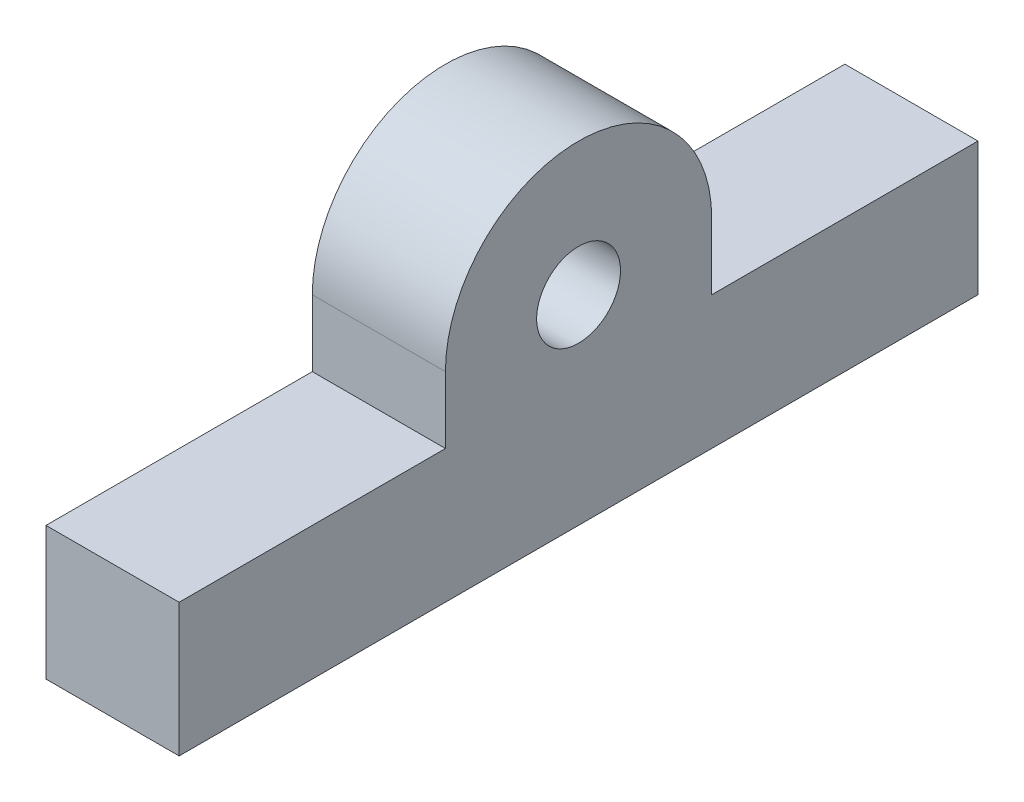
ISO-10303-21;
HEADER;
FILE_DESCRIPTION(('STEP AP214'),'2;1');
FILE_NAME('part.step','',(''),(''),'','','');
FILE_SCHEMA(('AUTOMOTIVE_DESIGN { 1 0 10303 214 1 1 1 1 }'));
ENDSEC;
DATA;
#1=APPLICATION_CONTEXT('core data for automotive mechanical design processes');
#2=APPLICATION_PROTOCOL_DEFINITION('international standard','automotive_design',2000,#1);
#3=PRODUCT_CONTEXT('',#1,'mechanical');
#4=PRODUCT('Part','Part','',(#3));
#5=PRODUCT_RELATED_PRODUCT_CATEGORY('part','',(#4));
#6=PRODUCT_DEFINITION_FORMATION('','',#4);
#7=PRODUCT_DEFINITION_CONTEXT('part definition',#1,'design');
#8=PRODUCT_DEFINITION('design','',#6,#7);
#9=PRODUCT_DEFINITION_SHAPE('','',#8);
#10=(LENGTH_UNIT() NAMED_UNIT(*) SI_UNIT(.MILLI.,.METRE.));
#11=(NAMED_UNIT(*) PLANE_ANGLE_UNIT() SI_UNIT($,.RADIAN.));
#12=(NAMED_UNIT(*) SI_UNIT($,.STERADIAN.) SOLID_ANGLE_UNIT());
#13=UNCERTAINTY_MEASURE_WITH_UNIT(LENGTH_MEASURE(1.E-05),#10,'distance_accuracy_value','');
#14=(GEOMETRIC_REPRESENTATION_CONTEXT(3) GLOBAL_UNCERTAINTY_ASSIGNED_CONTEXT((#13)) GLOBAL_UNIT_ASSIGNED_CONTEXT((#10,
#11,#12)) REPRESENTATION_CONTEXT('',''));
#15=CARTESIAN_POINT('',(0.,0.,0.));
#16=DIRECTION('',(0.,0.,1.));
#17=DIRECTION('',(1.,0.,0.));
#18=AXIS2_PLACEMENT_3D('',#15,#16,#17);
#19=CARTESIAN_POINT('',(12.7,12.7,0.));
#20=DIRECTION('',(0.,0.,-1.));
#21=DIRECTION('',(0.,1.,0.));
#22=AXIS2_PLACEMENT_3D('',#19,#20,#21);
#23=PLANE('',#22);
#24=DIRECTION('',(0.,-1.,0.));
#25=VECTOR('',#24,1.);
#26=CARTESIAN_POINT('',(0.,12.7,0.));
#27=LINE('',#26,#25);
#28=CARTESIAN_POINT('',(0.,12.7,0.));
#29=VERTEX_POINT('',#28);
#30=CARTESIAN_POINT('',(0.,0.,0.));
#31=VERTEX_POINT('',#30);
#32=EDGE_CURVE('E133',#29,#31,#27,.T.);
#33=ORIENTED_EDGE('',*,*,#32,.T.);
#34=DIRECTION('',(-1.,0.,0.));
#35=VECTOR('',#34,1.);
#36=CARTESIAN_POINT('',(12.7,0.,0.));
#37=LINE('',#36,#35);
#38=CARTESIAN_POINT('',(12.7,0.,0.));
#39=VERTEX_POINT('',#38);
#40=EDGE_CURVE('E11',#39,#31,#37,.T.);
#41=ORIENTED_EDGE('',*,*,#40,.F.);
#42=DIRECTION('',(0.,-1.,0.));
#43=VECTOR('',#42,1.);
#44=CARTESIAN_POINT('',(12.7,12.7,0.));
#45=LINE('',#44,#43);
#46=CARTESIAN_POINT('',(12.7,12.7,0.));
#47=VERTEX_POINT('',#46);
#48=EDGE_CURVE('E148',#47,#39,#45,.T.);
#49=ORIENTED_EDGE('',*,*,#48,.F.);
#50=DIRECTION('',(-1.,0.,0.));
#51=VECTOR('',#50,1.);
#52=CARTESIAN_POINT('',(12.7,12.7,0.));
#53=LINE('',#52,#51);
#54=EDGE_CURVE('E129',#47,#29,#53,.T.);
#55=ORIENTED_EDGE('',*,*,#54,.T.);
#56=EDGE_LOOP('',(#33,#41,#49,#55));
#57=FACE_BOUND('',#56,.T.);
#58=ADVANCED_FACE('F37',(#57),#23,.F.);
#59=CARTESIAN_POINT('',(12.7,0.,0.));
#60=DIRECTION('',(0.,1.,0.));
#61=DIRECTION('',(0.,0.,1.));
#62=AXIS2_PLACEMENT_3D('',#59,#60,#61);
#63=PLANE('',#62);
#64=CARTESIAN_POINT('',(6.35,0.,-12.7));
#65=DIRECTION('',(0.,-1.,0.));
#66=DIRECTION('',(0.,0.,-1.));
#67=AXIS2_PLACEMENT_3D('',#64,#65,#66);
#68=CIRCLE('',#67,1.27);
#69=CARTESIAN_POINT('',(6.35,0.,-13.97));
#70=VERTEX_POINT('',#69);
#71=EDGE_CURVE('E193',#70,#70,#68,.T.);
#72=ORIENTED_EDGE('',*,*,#71,.F.);
#73=EDGE_LOOP('',(#72));
#74=FACE_BOUND('',#73,.T.);
#75=CARTESIAN_POINT('',(6.35,0.,-63.5));
#76=DIRECTION('',(0.,-1.,0.));
#77=DIRECTION('',(0.,0.,-1.));
#78=AXIS2_PLACEMENT_3D('',#75,#76,#77);
#79=CIRCLE('',#78,1.27);
#80=CARTESIAN_POINT('',(6.35,0.,-64.77));
#81=VERTEX_POINT('',#80);
#82=EDGE_CURVE('E190',#81,#81,#79,.T.);
#83=ORIENTED_EDGE('',*,*,#82,.F.);
#84=EDGE_LOOP('',(#83));
#85=FACE_BOUND('',#84,.T.);
#86=DIRECTION('',(0.,0.,-1.));
#87=VECTOR('',#86,1.);
#88=CARTESIAN_POINT('',(0.,0.,0.));
#89=LINE('',#88,#87);
#90=CARTESIAN_POINT('',(0.,0.,-76.2));
#91=VERTEX_POINT('',#90);
#92=EDGE_CURVE('E136',#31,#91,#89,.T.);
#93=ORIENTED_EDGE('',*,*,#92,.T.);
#94=DIRECTION('',(-1.,0.,0.));
#95=VECTOR('',#94,1.);
#96=CARTESIAN_POINT('',(12.7,0.,-76.2));
#97=LINE('',#96,#95);
#98=CARTESIAN_POINT('',(12.7,0.,-76.2));
#99=VERTEX_POINT('',#98);
#100=EDGE_CURVE('E45',#99,#91,#97,.T.);
#101=ORIENTED_EDGE('',*,*,#100,.F.);
#102=DIRECTION('',(0.,0.,-1.));
#103=VECTOR('',#102,1.);
#104=CARTESIAN_POINT('',(12.7,0.,0.));
#105=LINE('',#104,#103);
#106=EDGE_CURVE('E96',#39,#99,#105,.T.);
#107=ORIENTED_EDGE('',*,*,#106,.F.);
#108=ORIENTED_EDGE('',*,*,#40,.T.);
#109=EDGE_LOOP('',(#93,#101,#107,#108));
#110=FACE_BOUND('',#109,.T.);
#111=ADVANCED_FACE('F208',(#74,#85,#110),#63,.F.);
#112=CARTESIAN_POINT('',(12.7,0.,-76.2));
#113=DIRECTION('',(0.,0.,1.));
#114=DIRECTION('',(1.,0.,0.));
#115=AXIS2_PLACEMENT_3D('',#112,#113,#114);
#116=PLANE('',#115);
#117=DIRECTION('',(0.,1.,0.));
#118=VECTOR('',#117,1.);
#119=CARTESIAN_POINT('',(0.,0.,-76.2));
#120=LINE('',#119,#118);
#121=CARTESIAN_POINT('',(0.,12.7,-76.2));
#122=VERTEX_POINT('',#121);
#123=EDGE_CURVE('E139',#91,#122,#120,.T.);
#124=ORIENTED_EDGE('',*,*,#123,.T.);
#125=DIRECTION('',(-1.,0.,0.));
#126=VECTOR('',#125,1.);
#127=CARTESIAN_POINT('',(12.7,12.7,-76.2));
#128=LINE('',#127,#126);
#129=CARTESIAN_POINT('',(12.7,12.7,-76.2));
#130=VERTEX_POINT('',#129);
#131=EDGE_CURVE('E155',#130,#122,#128,.T.);
#132=ORIENTED_EDGE('',*,*,#131,.F.);
#133=DIRECTION('',(0.,1.,0.));
#134=VECTOR('',#133,1.);
#135=CARTESIAN_POINT('',(12.7,0.,-76.2));
#136=LINE('',#135,#134);
#137=EDGE_CURVE('E163',#99,#130,#136,.T.);
#138=ORIENTED_EDGE('',*,*,#137,.F.);
#139=ORIENTED_EDGE('',*,*,#100,.T.);
#140=EDGE_LOOP('',(#124,#132,#138,#139));
#141=FACE_BOUND('',#140,.T.);
#142=ADVANCED_FACE('F161',(#141),#116,.F.);
#143=CARTESIAN_POINT('',(12.7,12.7,-76.2));
#144=DIRECTION('',(0.,-1.,0.));
#145=DIRECTION('',(0.,0.,-1.));
#146=AXIS2_PLACEMENT_3D('',#143,#144,#145);
#147=PLANE('',#146);
#148=DIRECTION('',(0.,0.,1.));
#149=VECTOR('',#148,1.);
#150=CARTESIAN_POINT('',(0.,12.7,-76.2));
#151=LINE('',#150,#149);
#152=CARTESIAN_POINT('',(0.,12.7,-50.8));
#153=VERTEX_POINT('',#152);
#154=EDGE_CURVE('E141',#122,#153,#151,.T.);
#155=ORIENTED_EDGE('',*,*,#154,.T.);
#156=DIRECTION('',(-1.,0.,0.));
#157=VECTOR('',#156,1.);
#158=CARTESIAN_POINT('',(12.7,12.7,-50.8));
#159=LINE('',#158,#157);
#160=CARTESIAN_POINT('',(12.7,12.7,-50.8));
#161=VERTEX_POINT('',#160);
#162=EDGE_CURVE('E152',#161,#153,#159,.T.);
#163=ORIENTED_EDGE('',*,*,#162,.F.);
#164=DIRECTION('',(0.,0.,1.));
#165=VECTOR('',#164,1.);
#166=CARTESIAN_POINT('',(12.7,12.7,-76.2));
#167=LINE('',#166,#165);
#168=EDGE_CURVE('E175',#130,#161,#167,.T.);
#169=ORIENTED_EDGE('',*,*,#168,.F.);
#170=ORIENTED_EDGE('',*,*,#131,.T.);
#171=EDGE_LOOP('',(#155,#163,#169,#170));
#172=FACE_BOUND('',#171,.T.);
#173=ADVANCED_FACE('F171',(#172),#147,.F.);
#174=CARTESIAN_POINT('',(12.7,12.7,-50.8));
#175=DIRECTION('',(0.,0.,1.));
#176=DIRECTION('',(0.,-1.,0.));
#177=AXIS2_PLACEMENT_3D('',#174,#175,#176);
#178=PLANE('',#177);
#179=DIRECTION('',(0.,1.,0.));
#180=VECTOR('',#179,1.);
#181=CARTESIAN_POINT('',(0.,12.7,-50.8));
#182=LINE('',#181,#180);
#183=CARTESIAN_POINT('',(0.,19.05,-50.8));
#184=VERTEX_POINT('',#183);
#185=EDGE_CURVE('E143',#153,#184,#182,.T.);
#186=ORIENTED_EDGE('',*,*,#185,.T.);
#187=DIRECTION('',(-1.,0.,0.));
#188=VECTOR('',#187,1.);
#189=CARTESIAN_POINT('',(12.7,19.05,-50.8));
#190=LINE('',#189,#188);
#191=CARTESIAN_POINT('',(12.7,19.05,-50.8));
#192=VERTEX_POINT('',#191);
#193=EDGE_CURVE('E124',#192,#184,#190,.T.);
#194=ORIENTED_EDGE('',*,*,#193,.F.);
#195=DIRECTION('',(0.,1.,0.));
#196=VECTOR('',#195,1.);
#197=CARTESIAN_POINT('',(12.7,12.7,-50.8));
#198=LINE('',#197,#196);
#199=EDGE_CURVE('E115',#161,#192,#198,.T.);
#200=ORIENTED_EDGE('',*,*,#199,.F.);
#201=ORIENTED_EDGE('',*,*,#162,.T.);
#202=EDGE_LOOP('',(#186,#194,#200,#201));
#203=FACE_BOUND('',#202,.T.);
#204=ADVANCED_FACE('F174',(#203),#178,.F.);
#205=CARTESIAN_POINT('',(12.7,19.05,-38.1));
#206=DIRECTION('',(-1.,0.,0.));
#207=DIRECTION('',(0.,0.,1.));
#208=AXIS2_PLACEMENT_3D('',#205,#206,#207);
#209=CYLINDRICAL_SURFACE('',#208,12.7);
#210=CARTESIAN_POINT('',(0.,19.05,-38.1));
#211=DIRECTION('',(1.,0.,0.));
#212=DIRECTION('',(0.,0.,-1.));
#213=AXIS2_PLACEMENT_3D('',#210,#211,#212);
#214=CIRCLE('',#213,12.7);
#215=CARTESIAN_POINT('',(0.,19.05,-25.4));
#216=VERTEX_POINT('',#215);
#217=EDGE_CURVE('E123',#184,#216,#214,.T.);
#218=ORIENTED_EDGE('',*,*,#217,.T.);
#219=DIRECTION('',(-1.,0.,0.));
#220=VECTOR('',#219,1.);
#221=CARTESIAN_POINT('',(12.7,19.05,-25.4));
#222=LINE('',#221,#220);
#223=CARTESIAN_POINT('',(12.7,19.05,-25.4));
#224=VERTEX_POINT('',#223);
#225=EDGE_CURVE('E120',#224,#216,#222,.T.);
#226=ORIENTED_EDGE('',*,*,#225,.F.);
#227=CARTESIAN_POINT('',(12.7,19.05,-38.1));
#228=DIRECTION('',(1.,0.,0.));
#229=DIRECTION('',(0.,0.,-1.));
#230=AXIS2_PLACEMENT_3D('',#227,#228,#229);
#231=CIRCLE('',#230,12.7);
#232=EDGE_CURVE('E109',#192,#224,#231,.T.);
#233=ORIENTED_EDGE('',*,*,#232,.F.);
#234=ORIENTED_EDGE('',*,*,#193,.T.);
#235=EDGE_LOOP('',(#218,#226,#233,#234));
#236=FACE_BOUND('',#235,.T.);
#237=ADVANCED_FACE('F121',(#236),#209,.T.);
#238=CARTESIAN_POINT('',(12.7,19.05,-25.4));
#239=DIRECTION('',(0.,0.,-1.));
#240=DIRECTION('',(0.,1.,0.));
#241=AXIS2_PLACEMENT_3D('',#238,#239,#240);
#242=PLANE('',#241);
#243=DIRECTION('',(0.,-1.,0.));
#244=VECTOR('',#243,1.);
#245=CARTESIAN_POINT('',(0.,19.05,-25.4));
#246=LINE('',#245,#244);
#247=CARTESIAN_POINT('',(0.,12.7,-25.4));
#248=VERTEX_POINT('',#247);
#249=EDGE_CURVE('E82',#216,#248,#246,.T.);
#250=ORIENTED_EDGE('',*,*,#249,.T.);
#251=DIRECTION('',(-1.,0.,0.));
#252=VECTOR('',#251,1.);
#253=CARTESIAN_POINT('',(12.7,12.7,-25.4));
#254=LINE('',#253,#252);
#255=CARTESIAN_POINT('',(12.7,12.7,-25.4));
#256=VERTEX_POINT('',#255);
#257=EDGE_CURVE('E125',#256,#248,#254,.T.);
#258=ORIENTED_EDGE('',*,*,#257,.F.);
#259=DIRECTION('',(0.,-1.,0.));
#260=VECTOR('',#259,1.);
#261=CARTESIAN_POINT('',(12.7,19.05,-25.4));
#262=LINE('',#261,#260);
#263=EDGE_CURVE('E113',#224,#256,#262,.T.);
#264=ORIENTED_EDGE('',*,*,#263,.F.);
#265=ORIENTED_EDGE('',*,*,#225,.T.);
#266=EDGE_LOOP('',(#250,#258,#264,#265));
#267=FACE_BOUND('',#266,.T.);
#268=ADVANCED_FACE('F127',(#267),#242,.F.);
#269=CARTESIAN_POINT('',(12.7,12.7,-25.4));
#270=DIRECTION('',(0.,-1.,0.));
#271=DIRECTION('',(0.,0.,-1.));
#272=AXIS2_PLACEMENT_3D('',#269,#270,#271);
#273=PLANE('',#272);
#274=DIRECTION('',(0.,0.,1.));
#275=VECTOR('',#274,1.);
#276=CARTESIAN_POINT('',(0.,12.7,-25.4));
#277=LINE('',#276,#275);
#278=EDGE_CURVE('E88',#248,#29,#277,.T.);
#279=ORIENTED_EDGE('',*,*,#278,.T.);
#280=ORIENTED_EDGE('',*,*,#54,.F.);
#281=DIRECTION('',(0.,0.,1.));
#282=VECTOR('',#281,1.);
#283=CARTESIAN_POINT('',(12.7,12.7,-25.4));
#284=LINE('',#283,#282);
#285=EDGE_CURVE('E53',#256,#47,#284,.T.);
#286=ORIENTED_EDGE('',*,*,#285,.F.);
#287=ORIENTED_EDGE('',*,*,#257,.T.);
#288=EDGE_LOOP('',(#279,#280,#286,#287));
#289=FACE_BOUND('',#288,.T.);
#290=ADVANCED_FACE('F215',(#289),#273,.F.);
#291=CARTESIAN_POINT('',(12.7,19.05,-38.1));
#292=DIRECTION('',(1.,0.,0.));
#293=DIRECTION('',(0.,0.,-1.));
#294=AXIS2_PLACEMENT_3D('',#291,#292,#293);
#295=PLANE('',#294);
#296=CARTESIAN_POINT('',(12.7,19.05,-38.1));
#297=DIRECTION('',(1.,0.,0.));
#298=DIRECTION('',(0.,0.,-1.));
#299=AXIS2_PLACEMENT_3D('',#296,#297,#298);
#300=CIRCLE('',#299,4.00000000000001);
#301=CARTESIAN_POINT('',(12.7,19.05,-42.1));
#302=VERTEX_POINT('',#301);
#303=EDGE_CURVE('E181',#302,#302,#300,.T.);
#304=ORIENTED_EDGE('',*,*,#303,.F.);
#305=EDGE_LOOP('',(#304));
#306=FACE_BOUND('',#305,.T.);
#307=ORIENTED_EDGE('',*,*,#48,.T.);
#308=ORIENTED_EDGE('',*,*,#106,.T.);
#309=ORIENTED_EDGE('',*,*,#137,.T.);
#310=ORIENTED_EDGE('',*,*,#168,.T.);
#311=ORIENTED_EDGE('',*,*,#199,.T.);
#312=ORIENTED_EDGE('',*,*,#232,.T.);
#313=ORIENTED_EDGE('',*,*,#263,.T.);
#314=ORIENTED_EDGE('',*,*,#285,.T.);
#315=EDGE_LOOP('',(#307,#308,#309,#310,#311,#312,#313,#314));
#316=FACE_BOUND('',#315,.T.);
#317=ADVANCED_FACE('F111',(#306,#316),#295,.T.);
#318=CARTESIAN_POINT('',(0.,19.05,-38.1));
#319=DIRECTION('',(1.,0.,0.));
#320=DIRECTION('',(0.,0.,-1.));
#321=AXIS2_PLACEMENT_3D('',#318,#319,#320);
#322=PLANE('',#321);
#323=CARTESIAN_POINT('',(0.,19.05,-38.1));
#324=DIRECTION('',(1.,0.,0.));
#325=DIRECTION('',(0.,0.,-1.));
#326=AXIS2_PLACEMENT_3D('',#323,#324,#325);
#327=CIRCLE('',#326,4.00000000000001);
#328=CARTESIAN_POINT('',(0.,19.05,-42.1));
#329=VERTEX_POINT('',#328);
#330=EDGE_CURVE('E137',#329,#329,#327,.T.);
#331=ORIENTED_EDGE('',*,*,#330,.T.);
#332=EDGE_LOOP('',(#331));
#333=FACE_BOUND('',#332,.T.);
#334=ORIENTED_EDGE('',*,*,#32,.F.);
#335=ORIENTED_EDGE('',*,*,#278,.F.);
#336=ORIENTED_EDGE('',*,*,#249,.F.);
#337=ORIENTED_EDGE('',*,*,#217,.F.);
#338=ORIENTED_EDGE('',*,*,#185,.F.);
#339=ORIENTED_EDGE('',*,*,#154,.F.);
#340=ORIENTED_EDGE('',*,*,#123,.F.);
#341=ORIENTED_EDGE('',*,*,#92,.F.);
#342=EDGE_LOOP('',(#334,#335,#336,#337,#338,#339,#340,#341));
#343=FACE_BOUND('',#342,.T.);
#344=ADVANCED_FACE('F167',(#333,#343),#322,.F.);
#345=CARTESIAN_POINT('',(0.,19.05,-38.1));
#346=DIRECTION('',(1.,0.,0.));
#347=DIRECTION('',(0.,0.,-1.));
#348=AXIS2_PLACEMENT_3D('',#345,#346,#347);
#349=CYLINDRICAL_SURFACE('',#348,4.00000000000001);
#350=ORIENTED_EDGE('',*,*,#330,.F.);
#351=EDGE_LOOP('',(#350));
#352=FACE_BOUND('',#351,.T.);
#353=ORIENTED_EDGE('',*,*,#303,.T.);
#354=EDGE_LOOP('',(#353));
#355=FACE_BOUND('',#354,.T.);
#356=ADVANCED_FACE('F284',(#352,#355),#349,.F.);
#357=CARTESIAN_POINT('',(6.35,6.35,-63.5));
#358=DIRECTION('',(0.,-1.,0.));
#359=DIRECTION('',(0.,0.,-1.));
#360=AXIS2_PLACEMENT_3D('',#357,#358,#359);
#361=CYLINDRICAL_SURFACE('',#360,1.27);
#362=CARTESIAN_POINT('',(6.35,6.35,-63.5));
#363=DIRECTION('',(0.,-1.,0.));
#364=DIRECTION('',(0.,0.,-1.));
#365=AXIS2_PLACEMENT_3D('',#362,#363,#364);
#366=CIRCLE('',#365,1.27);
#367=CARTESIAN_POINT('',(6.35,6.35,-64.77));
#368=VERTEX_POINT('',#367);
#369=EDGE_CURVE('E187',#368,#368,#366,.T.);
#370=ORIENTED_EDGE('',*,*,#369,.F.);
#371=EDGE_LOOP('',(#370));
#372=FACE_BOUND('',#371,.T.);
#373=ORIENTED_EDGE('',*,*,#82,.T.);
#374=EDGE_LOOP('',(#373));
#375=FACE_BOUND('',#374,.T.);
#376=ADVANCED_FACE('F293',(#372,#375),#361,.F.);
#377=CARTESIAN_POINT('',(6.35,6.35,-63.5));
#378=DIRECTION('',(0.,-1.,0.));
#379=DIRECTION('',(0.,0.,-1.));
#380=AXIS2_PLACEMENT_3D('',#377,#378,#379);
#381=PLANE('',#380);
#382=ORIENTED_EDGE('',*,*,#369,.T.);
#383=EDGE_LOOP('',(#382));
#384=FACE_BOUND('',#383,.T.);
#385=ADVANCED_FACE('F204',(#384),#381,.T.);
#386=CARTESIAN_POINT('',(6.35,6.35,-12.7));
#387=DIRECTION('',(0.,-1.,0.));
#388=DIRECTION('',(0.,0.,-1.));
#389=AXIS2_PLACEMENT_3D('',#386,#387,#388);
#390=CYLINDRICAL_SURFACE('',#389,1.27);
#391=CARTESIAN_POINT('',(6.35,6.35,-12.7));
#392=DIRECTION('',(0.,-1.,0.));
#393=DIRECTION('',(0.,0.,-1.));
#394=AXIS2_PLACEMENT_3D('',#391,#392,#393);
#395=CIRCLE('',#394,1.27);
#396=CARTESIAN_POINT('',(6.35,6.35,-13.97));
#397=VERTEX_POINT('',#396);
#398=EDGE_CURVE('E184',#397,#397,#395,.T.);
#399=ORIENTED_EDGE('',*,*,#398,.F.);
#400=EDGE_LOOP('',(#399));
#401=FACE_BOUND('',#400,.T.);
#402=ORIENTED_EDGE('',*,*,#71,.T.);
#403=EDGE_LOOP('',(#402));
#404=FACE_BOUND('',#403,.T.);
#405=ADVANCED_FACE('F201',(#401,#404),#390,.F.);
#406=CARTESIAN_POINT('',(6.35,6.35,-12.7));
#407=DIRECTION('',(0.,-1.,0.));
#408=DIRECTION('',(0.,0.,-1.));
#409=AXIS2_PLACEMENT_3D('',#406,#407,#408);
#410=PLANE('',#409);
#411=ORIENTED_EDGE('',*,*,#398,.T.);
#412=EDGE_LOOP('',(#411));
#413=FACE_BOUND('',#412,.T.);
#414=ADVANCED_FACE('F199',(#413),#410,.T.);
#415=CLOSED_SHELL('',(#58,#111,#142,#173,#204,#237,#268,#290,#317,#344,#356,#376,#385,#405,#414));
#416=MANIFOLD_SOLID_BREP('B2',#415);
#417=ADVANCED_BREP_SHAPE_REPRESENTATION('',(#18,#416),#14);
#418=SHAPE_DEFINITION_REPRESENTATION(#9,#417);
ENDSEC;
END-ISO-10303-21;
